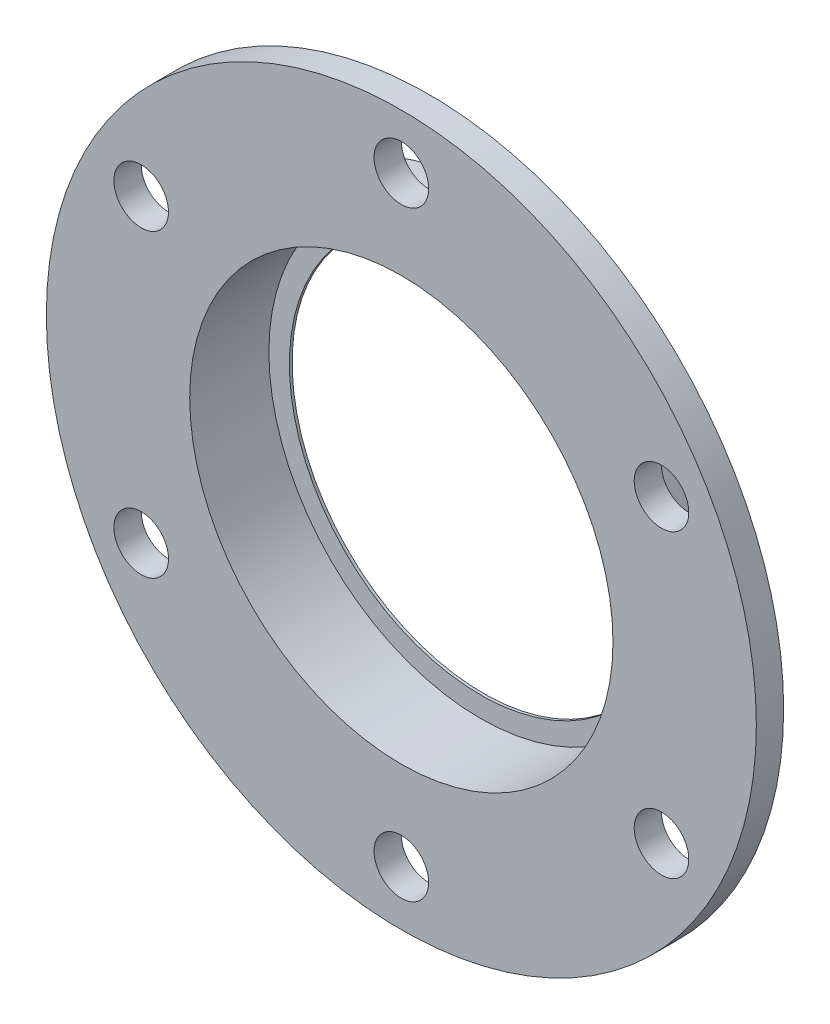
ISO-10303-21;
HEADER;
FILE_DESCRIPTION(('STEP AP214'),'2;1');
FILE_NAME('part.step','',(''),(''),'','','');
FILE_SCHEMA(('AUTOMOTIVE_DESIGN { 1 0 10303 214 1 1 1 1 }'));
ENDSEC;
DATA;
#1=APPLICATION_CONTEXT('core data for automotive mechanical design processes');
#2=APPLICATION_PROTOCOL_DEFINITION('international standard','automotive_design',2000,#1);
#3=PRODUCT_CONTEXT('',#1,'mechanical');
#4=PRODUCT('Part','Part','',(#3));
#5=PRODUCT_RELATED_PRODUCT_CATEGORY('part','',(#4));
#6=PRODUCT_DEFINITION_FORMATION('','',#4);
#7=PRODUCT_DEFINITION_CONTEXT('part definition',#1,'design');
#8=PRODUCT_DEFINITION('design','',#6,#7);
#9=PRODUCT_DEFINITION_SHAPE('','',#8);
#10=(LENGTH_UNIT() NAMED_UNIT(*) SI_UNIT(.MILLI.,.METRE.));
#11=(NAMED_UNIT(*) PLANE_ANGLE_UNIT() SI_UNIT($,.RADIAN.));
#12=(NAMED_UNIT(*) SI_UNIT($,.STERADIAN.) SOLID_ANGLE_UNIT());
#13=UNCERTAINTY_MEASURE_WITH_UNIT(LENGTH_MEASURE(1.E-05),#10,'distance_accuracy_value','');
#14=(GEOMETRIC_REPRESENTATION_CONTEXT(3) GLOBAL_UNCERTAINTY_ASSIGNED_CONTEXT((#13)) GLOBAL_UNIT_ASSIGNED_CONTEXT((#10,
#11,#12)) REPRESENTATION_CONTEXT('',''));
#15=CARTESIAN_POINT('',(0.,0.,0.));
#16=DIRECTION('',(0.,0.,1.));
#17=DIRECTION('',(1.,0.,0.));
#18=AXIS2_PLACEMENT_3D('',#15,#16,#17);
#19=CARTESIAN_POINT('',(0.,0.,15.));
#20=DIRECTION('',(0.,0.,-1.));
#21=DIRECTION('',(-1.,0.,0.));
#22=AXIS2_PLACEMENT_3D('',#19,#20,#21);
#23=CYLINDRICAL_SURFACE('',#22,45.);
#24=CARTESIAN_POINT('',(0.,0.,0.));
#25=DIRECTION('',(0.,0.,1.));
#26=DIRECTION('',(1.,0.,0.));
#27=AXIS2_PLACEMENT_3D('',#24,#25,#26);
#28=CIRCLE('',#27,45.);
#29=CARTESIAN_POINT('',(45.,0.,0.));
#30=VERTEX_POINT('',#29);
#31=EDGE_CURVE('E47',#30,#30,#28,.T.);
#32=ORIENTED_EDGE('',*,*,#31,.T.);
#33=EDGE_LOOP('',(#32));
#34=FACE_BOUND('',#33,.T.);
#35=CARTESIAN_POINT('',(0.,0.,10.));
#36=DIRECTION('',(0.,0.,1.));
#37=DIRECTION('',(1.,0.,0.));
#38=AXIS2_PLACEMENT_3D('',#35,#36,#37);
#39=CIRCLE('',#38,45.);
#40=CARTESIAN_POINT('',(45.,0.,10.));
#41=VERTEX_POINT('',#40);
#42=EDGE_CURVE('E11',#41,#41,#39,.T.);
#43=ORIENTED_EDGE('',*,*,#42,.F.);
#44=EDGE_LOOP('',(#43));
#45=FACE_BOUND('',#44,.T.);
#46=ADVANCED_FACE('F41',(#34,#45),#23,.T.);
#47=CARTESIAN_POINT('',(0.,0.,15.));
#48=DIRECTION('',(0.,0.,1.));
#49=DIRECTION('',(1.,0.,0.));
#50=AXIS2_PLACEMENT_3D('',#47,#48,#49);
#51=PLANE('',#50);
#52=CARTESIAN_POINT('',(0.,55.,15.));
#53=DIRECTION('',(0.,0.,-1.));
#54=DIRECTION('',(-1.,0.,0.));
#55=AXIS2_PLACEMENT_3D('',#52,#53,#54);
#56=CIRCLE('',#55,5.);
#57=CARTESIAN_POINT('',(-5.,55.,15.));
#58=VERTEX_POINT('',#57);
#59=EDGE_CURVE('E70',#58,#58,#56,.T.);
#60=ORIENTED_EDGE('',*,*,#59,.T.);
#61=EDGE_LOOP('',(#60));
#62=FACE_BOUND('',#61,.T.);
#63=CARTESIAN_POINT('',(47.6313972081438,27.5000000000006,15.));
#64=DIRECTION('',(0.,0.,-1.));
#65=DIRECTION('',(-1.,0.,0.));
#66=AXIS2_PLACEMENT_3D('',#63,#64,#65);
#67=CIRCLE('',#66,5.);
#68=CARTESIAN_POINT('',(42.6313972081438,27.5000000000006,15.));
#69=VERTEX_POINT('',#68);
#70=EDGE_CURVE('E99',#69,#69,#67,.T.);
#71=ORIENTED_EDGE('',*,*,#70,.T.);
#72=EDGE_LOOP('',(#71));
#73=FACE_BOUND('',#72,.T.);
#74=CARTESIAN_POINT('',(47.6313972081444,-27.4999999999996,15.));
#75=DIRECTION('',(0.,0.,-1.));
#76=DIRECTION('',(-1.,0.,0.));
#77=AXIS2_PLACEMENT_3D('',#74,#75,#76);
#78=CIRCLE('',#77,4.99999999999999);
#79=CARTESIAN_POINT('',(42.6313972081444,-27.4999999999996,15.));
#80=VERTEX_POINT('',#79);
#81=EDGE_CURVE('E73',#80,#80,#78,.T.);
#82=ORIENTED_EDGE('',*,*,#81,.T.);
#83=EDGE_LOOP('',(#82));
#84=FACE_BOUND('',#83,.T.);
#85=CARTESIAN_POINT('',(3.84062947272745E-13,-55.,15.));
#86=DIRECTION('',(0.,0.,-1.));
#87=DIRECTION('',(-1.,0.,0.));
#88=AXIS2_PLACEMENT_3D('',#85,#86,#87);
#89=CIRCLE('',#88,5.);
#90=CARTESIAN_POINT('',(-4.99999999999962,-55.,15.));
#91=VERTEX_POINT('',#90);
#92=EDGE_CURVE('E80',#91,#91,#89,.T.);
#93=ORIENTED_EDGE('',*,*,#92,.T.);
#94=EDGE_LOOP('',(#93));
#95=FACE_BOUND('',#94,.T.);
#96=CARTESIAN_POINT('',(-47.631397208144,-27.5000000000002,15.));
#97=DIRECTION('',(0.,0.,-1.));
#98=DIRECTION('',(-1.,0.,0.));
#99=AXIS2_PLACEMENT_3D('',#96,#97,#98);
#100=CIRCLE('',#99,5.);
#101=CARTESIAN_POINT('',(-52.631397208144,-27.5000000000002,15.));
#102=VERTEX_POINT('',#101);
#103=EDGE_CURVE('E86',#102,#102,#100,.T.);
#104=ORIENTED_EDGE('',*,*,#103,.T.);
#105=EDGE_LOOP('',(#104));
#106=FACE_BOUND('',#105,.T.);
#107=CARTESIAN_POINT('',(-47.6313972081442,27.4999999999999,15.));
#108=DIRECTION('',(0.,0.,-1.));
#109=DIRECTION('',(-1.,0.,0.));
#110=AXIS2_PLACEMENT_3D('',#107,#108,#109);
#111=CIRCLE('',#110,4.99999999999999);
#112=CARTESIAN_POINT('',(-52.6313972081442,27.4999999999999,15.));
#113=VERTEX_POINT('',#112);
#114=EDGE_CURVE('E92',#113,#113,#111,.T.);
#115=ORIENTED_EDGE('',*,*,#114,.T.);
#116=EDGE_LOOP('',(#115));
#117=FACE_BOUND('',#116,.T.);
#118=CARTESIAN_POINT('',(0.,0.,15.));
#119=DIRECTION('',(0.,0.,1.));
#120=DIRECTION('',(1.,0.,0.));
#121=AXIS2_PLACEMENT_3D('',#118,#119,#120);
#122=CIRCLE('',#121,38.75);
#123=CARTESIAN_POINT('',(38.75,0.,15.));
#124=VERTEX_POINT('',#123);
#125=EDGE_CURVE('E55',#124,#124,#122,.T.);
#126=ORIENTED_EDGE('',*,*,#125,.F.);
#127=EDGE_LOOP('',(#126));
#128=FACE_BOUND('',#127,.T.);
#129=CARTESIAN_POINT('',(0.,0.,15.));
#130=DIRECTION('',(0.,0.,1.));
#131=DIRECTION('',(1.,0.,0.));
#132=AXIS2_PLACEMENT_3D('',#129,#130,#131);
#133=CIRCLE('',#132,65.);
#134=CARTESIAN_POINT('',(65.,0.,15.));
#135=VERTEX_POINT('',#134);
#136=EDGE_CURVE('E67',#135,#135,#133,.T.);
#137=ORIENTED_EDGE('',*,*,#136,.T.);
#138=EDGE_LOOP('',(#137));
#139=FACE_BOUND('',#138,.T.);
#140=ADVANCED_FACE('F109',(#62,#73,#84,#95,#106,#117,#128,#139),#51,.T.);
#141=CARTESIAN_POINT('',(0.,0.,0.));
#142=DIRECTION('',(0.,0.,1.));
#143=DIRECTION('',(1.,0.,0.));
#144=AXIS2_PLACEMENT_3D('',#141,#142,#143);
#145=PLANE('',#144);
#146=CARTESIAN_POINT('',(0.,0.,0.));
#147=DIRECTION('',(0.,0.,1.));
#148=DIRECTION('',(1.,0.,0.));
#149=AXIS2_PLACEMENT_3D('',#146,#147,#148);
#150=CIRCLE('',#149,35.);
#151=CARTESIAN_POINT('',(35.,0.,0.));
#152=VERTEX_POINT('',#151);
#153=EDGE_CURVE('E60',#152,#152,#150,.T.);
#154=ORIENTED_EDGE('',*,*,#153,.T.);
#155=EDGE_LOOP('',(#154));
#156=FACE_BOUND('',#155,.T.);
#157=ORIENTED_EDGE('',*,*,#31,.F.);
#158=EDGE_LOOP('',(#157));
#159=FACE_BOUND('',#158,.T.);
#160=ADVANCED_FACE('F144',(#156,#159),#145,.F.);
#161=CARTESIAN_POINT('',(0.,0.,-109.601551083915));
#162=DIRECTION('',(0.,0.,1.));
#163=DIRECTION('',(1.,0.,0.));
#164=AXIS2_PLACEMENT_3D('',#161,#162,#163);
#165=CYLINDRICAL_SURFACE('',#164,38.75);
#166=CARTESIAN_POINT('',(0.,0.,0.5));
#167=DIRECTION('',(0.,0.,1.));
#168=DIRECTION('',(1.,0.,0.));
#169=AXIS2_PLACEMENT_3D('',#166,#167,#168);
#170=CIRCLE('',#169,38.75);
#171=CARTESIAN_POINT('',(38.75,0.,0.5));
#172=VERTEX_POINT('',#171);
#173=EDGE_CURVE('E51',#172,#172,#170,.F.);
#174=ORIENTED_EDGE('',*,*,#173,.T.);
#175=EDGE_LOOP('',(#174));
#176=FACE_BOUND('',#175,.T.);
#177=ORIENTED_EDGE('',*,*,#125,.T.);
#178=EDGE_LOOP('',(#177));
#179=FACE_BOUND('',#178,.T.);
#180=ADVANCED_FACE('F150',(#176,#179),#165,.F.);
#181=CARTESIAN_POINT('',(0.,0.,0.5));
#182=DIRECTION('',(0.,0.,1.));
#183=DIRECTION('',(1.,0.,0.));
#184=AXIS2_PLACEMENT_3D('',#181,#182,#183);
#185=PLANE('',#184);
#186=CARTESIAN_POINT('',(0.,0.,0.5));
#187=DIRECTION('',(0.,0.,1.));
#188=DIRECTION('',(1.,0.,0.));
#189=AXIS2_PLACEMENT_3D('',#186,#187,#188);
#190=CIRCLE('',#189,35.);
#191=CARTESIAN_POINT('',(35.,0.,0.5));
#192=VERTEX_POINT('',#191);
#193=EDGE_CURVE('E61',#192,#192,#190,.T.);
#194=ORIENTED_EDGE('',*,*,#193,.F.);
#195=EDGE_LOOP('',(#194));
#196=FACE_BOUND('',#195,.T.);
#197=ORIENTED_EDGE('',*,*,#173,.F.);
#198=EDGE_LOOP('',(#197));
#199=FACE_BOUND('',#198,.T.);
#200=ADVANCED_FACE('F155',(#196,#199),#185,.T.);
#201=CARTESIAN_POINT('',(0.,0.,0.));
#202=DIRECTION('',(0.,0.,1.));
#203=DIRECTION('',(1.,0.,0.));
#204=AXIS2_PLACEMENT_3D('',#201,#202,#203);
#205=CYLINDRICAL_SURFACE('',#204,35.);
#206=ORIENTED_EDGE('',*,*,#153,.F.);
#207=EDGE_LOOP('',(#206));
#208=FACE_BOUND('',#207,.T.);
#209=ORIENTED_EDGE('',*,*,#193,.T.);
#210=EDGE_LOOP('',(#209));
#211=FACE_BOUND('',#210,.T.);
#212=ADVANCED_FACE('F139',(#208,#211),#205,.F.);
#213=CARTESIAN_POINT('',(0.,0.,10.));
#214=DIRECTION('',(0.,0.,1.));
#215=DIRECTION('',(1.,0.,0.));
#216=AXIS2_PLACEMENT_3D('',#213,#214,#215);
#217=CYLINDRICAL_SURFACE('',#216,65.);
#218=CARTESIAN_POINT('',(0.,0.,10.));
#219=DIRECTION('',(0.,0.,1.));
#220=DIRECTION('',(1.,0.,0.));
#221=AXIS2_PLACEMENT_3D('',#218,#219,#220);
#222=CIRCLE('',#221,65.);
#223=CARTESIAN_POINT('',(65.,0.,10.));
#224=VERTEX_POINT('',#223);
#225=EDGE_CURVE('E64',#224,#224,#222,.T.);
#226=ORIENTED_EDGE('',*,*,#225,.T.);
#227=EDGE_LOOP('',(#226));
#228=FACE_BOUND('',#227,.T.);
#229=ORIENTED_EDGE('',*,*,#136,.F.);
#230=EDGE_LOOP('',(#229));
#231=FACE_BOUND('',#230,.T.);
#232=ADVANCED_FACE('F123',(#228,#231),#217,.T.);
#233=CARTESIAN_POINT('',(0.,0.,10.));
#234=DIRECTION('',(0.,0.,1.));
#235=DIRECTION('',(1.,0.,0.));
#236=AXIS2_PLACEMENT_3D('',#233,#234,#235);
#237=PLANE('',#236);
#238=CARTESIAN_POINT('',(0.,55.,10.));
#239=DIRECTION('',(0.,0.,-1.));
#240=DIRECTION('',(-1.,0.,0.));
#241=AXIS2_PLACEMENT_3D('',#238,#239,#240);
#242=CIRCLE('',#241,5.);
#243=CARTESIAN_POINT('',(-5.,55.,10.));
#244=VERTEX_POINT('',#243);
#245=EDGE_CURVE('E98',#244,#244,#242,.T.);
#246=ORIENTED_EDGE('',*,*,#245,.F.);
#247=EDGE_LOOP('',(#246));
#248=FACE_BOUND('',#247,.T.);
#249=CARTESIAN_POINT('',(47.6313972081438,27.5000000000006,10.));
#250=DIRECTION('',(0.,0.,-1.));
#251=DIRECTION('',(-1.,0.,0.));
#252=AXIS2_PLACEMENT_3D('',#249,#250,#251);
#253=CIRCLE('',#252,5.);
#254=CARTESIAN_POINT('',(42.6313972081438,27.5000000000006,10.));
#255=VERTEX_POINT('',#254);
#256=EDGE_CURVE('E77',#255,#255,#253,.T.);
#257=ORIENTED_EDGE('',*,*,#256,.F.);
#258=EDGE_LOOP('',(#257));
#259=FACE_BOUND('',#258,.T.);
#260=CARTESIAN_POINT('',(47.6313972081444,-27.4999999999996,10.));
#261=DIRECTION('',(0.,0.,-1.));
#262=DIRECTION('',(-1.,0.,0.));
#263=AXIS2_PLACEMENT_3D('',#260,#261,#262);
#264=CIRCLE('',#263,4.99999999999999);
#265=CARTESIAN_POINT('',(42.6313972081444,-27.4999999999996,10.));
#266=VERTEX_POINT('',#265);
#267=EDGE_CURVE('E76',#266,#266,#264,.T.);
#268=ORIENTED_EDGE('',*,*,#267,.F.);
#269=EDGE_LOOP('',(#268));
#270=FACE_BOUND('',#269,.T.);
#271=CARTESIAN_POINT('',(3.84062947272745E-13,-55.,10.));
#272=DIRECTION('',(0.,0.,-1.));
#273=DIRECTION('',(-1.,0.,0.));
#274=AXIS2_PLACEMENT_3D('',#271,#272,#273);
#275=CIRCLE('',#274,5.);
#276=CARTESIAN_POINT('',(-4.99999999999962,-55.,10.));
#277=VERTEX_POINT('',#276);
#278=EDGE_CURVE('E83',#277,#277,#275,.T.);
#279=ORIENTED_EDGE('',*,*,#278,.F.);
#280=EDGE_LOOP('',(#279));
#281=FACE_BOUND('',#280,.T.);
#282=CARTESIAN_POINT('',(-47.631397208144,-27.5000000000002,10.));
#283=DIRECTION('',(0.,0.,-1.));
#284=DIRECTION('',(-1.,0.,0.));
#285=AXIS2_PLACEMENT_3D('',#282,#283,#284);
#286=CIRCLE('',#285,5.);
#287=CARTESIAN_POINT('',(-52.631397208144,-27.5000000000002,10.));
#288=VERTEX_POINT('',#287);
#289=EDGE_CURVE('E89',#288,#288,#286,.T.);
#290=ORIENTED_EDGE('',*,*,#289,.F.);
#291=EDGE_LOOP('',(#290));
#292=FACE_BOUND('',#291,.T.);
#293=CARTESIAN_POINT('',(-47.6313972081442,27.4999999999999,10.));
#294=DIRECTION('',(0.,0.,-1.));
#295=DIRECTION('',(-1.,0.,0.));
#296=AXIS2_PLACEMENT_3D('',#293,#294,#295);
#297=CIRCLE('',#296,4.99999999999999);
#298=CARTESIAN_POINT('',(-52.6313972081442,27.4999999999999,10.));
#299=VERTEX_POINT('',#298);
#300=EDGE_CURVE('E95',#299,#299,#297,.T.);
#301=ORIENTED_EDGE('',*,*,#300,.F.);
#302=EDGE_LOOP('',(#301));
#303=FACE_BOUND('',#302,.T.);
#304=ORIENTED_EDGE('',*,*,#42,.T.);
#305=EDGE_LOOP('',(#304));
#306=FACE_BOUND('',#305,.T.);
#307=ORIENTED_EDGE('',*,*,#225,.F.);
#308=EDGE_LOOP('',(#307));
#309=FACE_BOUND('',#308,.T.);
#310=ADVANCED_FACE('F119',(#248,#259,#270,#281,#292,#303,#306,#309),#237,.F.);
#311=CARTESIAN_POINT('',(-47.6313972081442,27.4999999999999,15.));
#312=DIRECTION('',(0.,0.,-1.));
#313=DIRECTION('',(-1.,0.,0.));
#314=AXIS2_PLACEMENT_3D('',#311,#312,#313);
#315=CYLINDRICAL_SURFACE('',#314,4.99999999999999);
#316=ORIENTED_EDGE('',*,*,#114,.F.);
#317=EDGE_LOOP('',(#316));
#318=FACE_BOUND('',#317,.T.);
#319=ORIENTED_EDGE('',*,*,#300,.T.);
#320=EDGE_LOOP('',(#319));
#321=FACE_BOUND('',#320,.T.);
#322=ADVANCED_FACE('F122',(#318,#321),#315,.F.);
#323=CARTESIAN_POINT('',(-47.631397208144,-27.5000000000002,15.));
#324=DIRECTION('',(0.,0.,-1.));
#325=DIRECTION('',(-1.,0.,0.));
#326=AXIS2_PLACEMENT_3D('',#323,#324,#325);
#327=CYLINDRICAL_SURFACE('',#326,5.);
#328=ORIENTED_EDGE('',*,*,#103,.F.);
#329=EDGE_LOOP('',(#328));
#330=FACE_BOUND('',#329,.T.);
#331=ORIENTED_EDGE('',*,*,#289,.T.);
#332=EDGE_LOOP('',(#331));
#333=FACE_BOUND('',#332,.T.);
#334=ADVANCED_FACE('F170',(#330,#333),#327,.F.);
#335=CARTESIAN_POINT('',(3.84062947272745E-13,-55.,15.));
#336=DIRECTION('',(0.,0.,-1.));
#337=DIRECTION('',(-1.,0.,0.));
#338=AXIS2_PLACEMENT_3D('',#335,#336,#337);
#339=CYLINDRICAL_SURFACE('',#338,5.);
#340=ORIENTED_EDGE('',*,*,#92,.F.);
#341=EDGE_LOOP('',(#340));
#342=FACE_BOUND('',#341,.T.);
#343=ORIENTED_EDGE('',*,*,#278,.T.);
#344=EDGE_LOOP('',(#343));
#345=FACE_BOUND('',#344,.T.);
#346=ADVANCED_FACE('F166',(#342,#345),#339,.F.);
#347=CARTESIAN_POINT('',(47.6313972081444,-27.4999999999996,15.));
#348=DIRECTION('',(0.,0.,-1.));
#349=DIRECTION('',(-1.,0.,0.));
#350=AXIS2_PLACEMENT_3D('',#347,#348,#349);
#351=CYLINDRICAL_SURFACE('',#350,4.99999999999999);
#352=ORIENTED_EDGE('',*,*,#81,.F.);
#353=EDGE_LOOP('',(#352));
#354=FACE_BOUND('',#353,.T.);
#355=ORIENTED_EDGE('',*,*,#267,.T.);
#356=EDGE_LOOP('',(#355));
#357=FACE_BOUND('',#356,.T.);
#358=ADVANCED_FACE('F163',(#354,#357),#351,.F.);
#359=CARTESIAN_POINT('',(47.6313972081438,27.5000000000006,15.));
#360=DIRECTION('',(0.,0.,-1.));
#361=DIRECTION('',(-1.,0.,0.));
#362=AXIS2_PLACEMENT_3D('',#359,#360,#361);
#363=CYLINDRICAL_SURFACE('',#362,5.);
#364=ORIENTED_EDGE('',*,*,#70,.F.);
#365=EDGE_LOOP('',(#364));
#366=FACE_BOUND('',#365,.T.);
#367=ORIENTED_EDGE('',*,*,#256,.T.);
#368=EDGE_LOOP('',(#367));
#369=FACE_BOUND('',#368,.T.);
#370=ADVANCED_FACE('F115',(#366,#369),#363,.F.);
#371=CARTESIAN_POINT('',(0.,55.,15.));
#372=DIRECTION('',(0.,0.,-1.));
#373=DIRECTION('',(-1.,0.,0.));
#374=AXIS2_PLACEMENT_3D('',#371,#372,#373);
#375=CYLINDRICAL_SURFACE('',#374,5.);
#376=ORIENTED_EDGE('',*,*,#59,.F.);
#377=EDGE_LOOP('',(#376));
#378=FACE_BOUND('',#377,.T.);
#379=ORIENTED_EDGE('',*,*,#245,.T.);
#380=EDGE_LOOP('',(#379));
#381=FACE_BOUND('',#380,.T.);
#382=ADVANCED_FACE('F112',(#378,#381),#375,.F.);
#383=CLOSED_SHELL('',(#46,#140,#160,#180,#200,#212,#232,#310,#322,#334,#346,#358,#370,#382));
#384=MANIFOLD_SOLID_BREP('B2',#383);
#385=ADVANCED_BREP_SHAPE_REPRESENTATION('',(#18,#384),#14);
#386=SHAPE_DEFINITION_REPRESENTATION(#9,#385);
ENDSEC;
END-ISO-10303-21;
